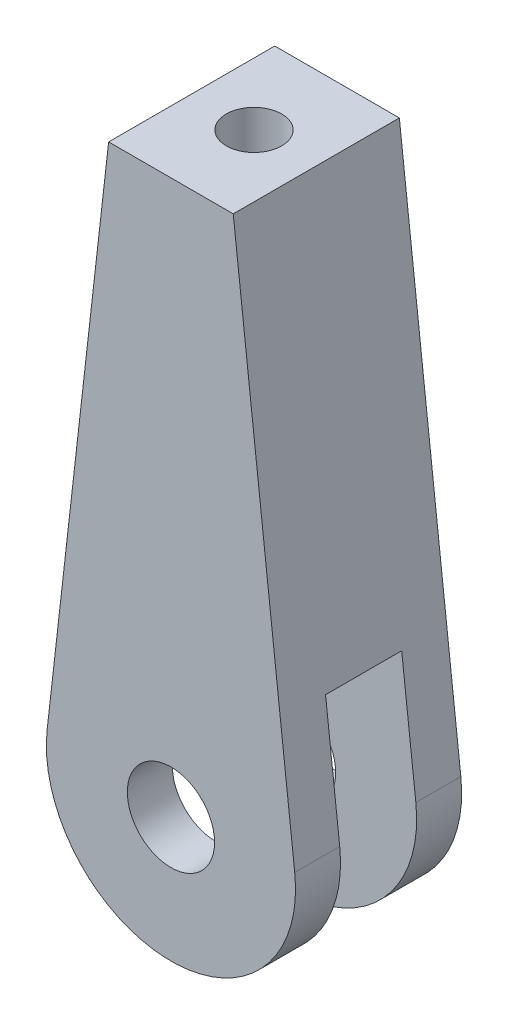
ISO-10303-21;
HEADER;
FILE_DESCRIPTION(('STEP AP214'),'2;1');
FILE_NAME('part.step','',(''),(''),'','','');
FILE_SCHEMA(('AUTOMOTIVE_DESIGN { 1 0 10303 214 1 1 1 1 }'));
ENDSEC;
DATA;
#1=APPLICATION_CONTEXT('core data for automotive mechanical design processes');
#2=APPLICATION_PROTOCOL_DEFINITION('international standard','automotive_design',2000,#1);
#3=PRODUCT_CONTEXT('',#1,'mechanical');
#4=PRODUCT('Part','Part','',(#3));
#5=PRODUCT_RELATED_PRODUCT_CATEGORY('part','',(#4));
#6=PRODUCT_DEFINITION_FORMATION('','',#4);
#7=PRODUCT_DEFINITION_CONTEXT('part definition',#1,'design');
#8=PRODUCT_DEFINITION('design','',#6,#7);
#9=PRODUCT_DEFINITION_SHAPE('','',#8);
#10=(LENGTH_UNIT() NAMED_UNIT(*) SI_UNIT(.MILLI.,.METRE.));
#11=(NAMED_UNIT(*) PLANE_ANGLE_UNIT() SI_UNIT($,.RADIAN.));
#12=(NAMED_UNIT(*) SI_UNIT($,.STERADIAN.) SOLID_ANGLE_UNIT());
#13=UNCERTAINTY_MEASURE_WITH_UNIT(LENGTH_MEASURE(1.E-05),#10,'distance_accuracy_value','');
#14=(GEOMETRIC_REPRESENTATION_CONTEXT(3) GLOBAL_UNCERTAINTY_ASSIGNED_CONTEXT((#13)) GLOBAL_UNIT_ASSIGNED_CONTEXT((#10,
#11,#12)) REPRESENTATION_CONTEXT('',''));
#15=CARTESIAN_POINT('',(0.,0.,0.));
#16=DIRECTION('',(0.,0.,1.));
#17=DIRECTION('',(1.,0.,0.));
#18=AXIS2_PLACEMENT_3D('',#15,#16,#17);
#19=CARTESIAN_POINT('',(-4.49999999999999,40.,12.));
#20=DIRECTION('',(0.993569552652104,-0.113223425326638,0.));
#21=DIRECTION('',(0.113223425326638,0.993569552652105,0.));
#22=AXIS2_PLACEMENT_3D('',#19,#20,#21);
#23=PLANE('',#22);
#24=DIRECTION('',(-0.113223425326638,-0.993569552652105,0.));
#25=VECTOR('',#24,1.);
#26=CARTESIAN_POINT('',(-4.49999999999999,40.,3.25));
#27=LINE('',#26,#25);
#28=CARTESIAN_POINT('',(-7.91868644296963,10.,3.25));
#29=VERTEX_POINT('',#28);
#30=CARTESIAN_POINT('',(-8.94212597386896,1.01901082793975,3.25));
#31=VERTEX_POINT('',#30);
#32=EDGE_CURVE('E116',#29,#31,#27,.T.);
#33=ORIENTED_EDGE('',*,*,#32,.F.);
#34=DIRECTION('',(0.,0.,1.));
#35=VECTOR('',#34,1.);
#36=CARTESIAN_POINT('',(-7.91868644296963,10.,12.));
#37=LINE('',#36,#35);
#38=CARTESIAN_POINT('',(-7.91868644296963,10.,8.75));
#39=VERTEX_POINT('',#38);
#40=EDGE_CURVE('E105',#29,#39,#37,.T.);
#41=ORIENTED_EDGE('',*,*,#40,.T.);
#42=DIRECTION('',(0.113223425326638,0.993569552652105,0.));
#43=VECTOR('',#42,1.);
#44=CARTESIAN_POINT('',(-4.49999999999999,40.,8.75));
#45=LINE('',#44,#43);
#46=CARTESIAN_POINT('',(-8.94212597386896,1.01901082793975,8.75));
#47=VERTEX_POINT('',#46);
#48=EDGE_CURVE('E131',#47,#39,#45,.T.);
#49=ORIENTED_EDGE('',*,*,#48,.F.);
#50=DIRECTION('',(0.,0.,-1.));
#51=VECTOR('',#50,1.);
#52=CARTESIAN_POINT('',(-8.94212597386896,1.01901082793975,12.));
#53=LINE('',#52,#51);
#54=CARTESIAN_POINT('',(-8.94212597386896,1.01901082793975,12.));
#55=VERTEX_POINT('',#54);
#56=EDGE_CURVE('E159',#55,#47,#53,.T.);
#57=ORIENTED_EDGE('',*,*,#56,.F.);
#58=DIRECTION('',(-0.113223425326638,-0.993569552652105,0.));
#59=VECTOR('',#58,1.);
#60=CARTESIAN_POINT('',(-4.49999999999999,40.,12.));
#61=LINE('',#60,#59);
#62=CARTESIAN_POINT('',(-4.49999999999999,40.,12.));
#63=VERTEX_POINT('',#62);
#64=EDGE_CURVE('E138',#63,#55,#61,.T.);
#65=ORIENTED_EDGE('',*,*,#64,.F.);
#66=DIRECTION('',(0.,0.,-1.));
#67=VECTOR('',#66,1.);
#68=CARTESIAN_POINT('',(-4.49999999999999,40.,12.));
#69=LINE('',#68,#67);
#70=CARTESIAN_POINT('',(-4.49999999999999,40.,0.));
#71=VERTEX_POINT('',#70);
#72=EDGE_CURVE('E144',#63,#71,#69,.T.);
#73=ORIENTED_EDGE('',*,*,#72,.T.);
#74=DIRECTION('',(-0.113223425326638,-0.993569552652105,0.));
#75=VECTOR('',#74,1.);
#76=CARTESIAN_POINT('',(-4.49999999999999,40.,0.));
#77=LINE('',#76,#75);
#78=CARTESIAN_POINT('',(-8.94212597386896,1.01901082793975,0.));
#79=VERTEX_POINT('',#78);
#80=EDGE_CURVE('E136',#71,#79,#77,.T.);
#81=ORIENTED_EDGE('',*,*,#80,.T.);
#82=EDGE_CURVE('E124',#31,#79,#53,.T.);
#83=ORIENTED_EDGE('',*,*,#82,.F.);
#84=EDGE_LOOP('',(#33,#41,#49,#57,#65,#73,#81,#83));
#85=FACE_BOUND('',#84,.T.);
#86=ADVANCED_FACE('F32',(#85),#23,.F.);
#87=CARTESIAN_POINT('',(0.,0.,12.));
#88=DIRECTION('',(0.,0.,-1.));
#89=DIRECTION('',(-1.,0.,0.));
#90=AXIS2_PLACEMENT_3D('',#87,#88,#89);
#91=CYLINDRICAL_SURFACE('',#90,9.00000000000002);
#92=CARTESIAN_POINT('',(0.,0.,3.25));
#93=DIRECTION('',(0.,0.,1.));
#94=DIRECTION('',(1.,0.,0.));
#95=AXIS2_PLACEMENT_3D('',#92,#93,#94);
#96=CIRCLE('',#95,9.00000000000002);
#97=CARTESIAN_POINT('',(8.94212597386897,1.01901082793975,3.25));
#98=VERTEX_POINT('',#97);
#99=EDGE_CURVE('E126',#31,#98,#96,.T.);
#100=ORIENTED_EDGE('',*,*,#99,.F.);
#101=ORIENTED_EDGE('',*,*,#82,.T.);
#102=CARTESIAN_POINT('',(0.,0.,0.));
#103=DIRECTION('',(0.,0.,1.));
#104=DIRECTION('',(1.,0.,0.));
#105=AXIS2_PLACEMENT_3D('',#102,#103,#104);
#106=CIRCLE('',#105,9.00000000000002);
#107=CARTESIAN_POINT('',(8.94212597386898,1.01901082793975,0.));
#108=VERTEX_POINT('',#107);
#109=EDGE_CURVE('E146',#79,#108,#106,.T.);
#110=ORIENTED_EDGE('',*,*,#109,.T.);
#111=DIRECTION('',(0.,0.,-1.));
#112=VECTOR('',#111,1.);
#113=CARTESIAN_POINT('',(8.94212597386898,1.01901082793975,12.));
#114=LINE('',#113,#112);
#115=EDGE_CURVE('E155',#98,#108,#114,.T.);
#116=ORIENTED_EDGE('',*,*,#115,.F.);
#117=EDGE_LOOP('',(#100,#101,#110,#116));
#118=FACE_BOUND('',#117,.T.);
#119=ADVANCED_FACE('F203',(#118),#91,.T.);
#120=CARTESIAN_POINT('',(0.,0.,8.75));
#121=DIRECTION('',(0.,0.,-1.));
#122=DIRECTION('',(-1.,0.,0.));
#123=AXIS2_PLACEMENT_3D('',#120,#121,#122);
#124=CIRCLE('',#123,9.00000000000002);
#125=CARTESIAN_POINT('',(8.94212597386897,1.01901082793975,8.75));
#126=VERTEX_POINT('',#125);
#127=EDGE_CURVE('E112',#126,#47,#124,.T.);
#128=ORIENTED_EDGE('',*,*,#127,.F.);
#129=CARTESIAN_POINT('',(8.94212597386898,1.01901082793975,12.));
#130=VERTEX_POINT('',#129);
#131=EDGE_CURVE('E156',#130,#126,#114,.T.);
#132=ORIENTED_EDGE('',*,*,#131,.F.);
#133=CARTESIAN_POINT('',(0.,0.,12.));
#134=DIRECTION('',(0.,0.,1.));
#135=DIRECTION('',(1.,0.,0.));
#136=AXIS2_PLACEMENT_3D('',#133,#134,#135);
#137=CIRCLE('',#136,9.00000000000002);
#138=EDGE_CURVE('E84',#55,#130,#137,.T.);
#139=ORIENTED_EDGE('',*,*,#138,.F.);
#140=ORIENTED_EDGE('',*,*,#56,.T.);
#141=EDGE_LOOP('',(#128,#132,#139,#140));
#142=FACE_BOUND('',#141,.T.);
#143=ADVANCED_FACE('F168',(#142),#91,.T.);
#144=CARTESIAN_POINT('',(4.50000000000001,40.,12.));
#145=DIRECTION('',(-0.993569552652105,-0.113223425326639,0.));
#146=DIRECTION('',(0.113223425326639,-0.993569552652105,0.));
#147=AXIS2_PLACEMENT_3D('',#144,#145,#146);
#148=PLANE('',#147);
#149=DIRECTION('',(-0.113223425326639,0.993569552652105,0.));
#150=VECTOR('',#149,1.);
#151=CARTESIAN_POINT('',(4.50000000000001,40.,3.25));
#152=LINE('',#151,#150);
#153=CARTESIAN_POINT('',(7.91868644296965,10.,3.25));
#154=VERTEX_POINT('',#153);
#155=EDGE_CURVE('E11',#98,#154,#152,.T.);
#156=ORIENTED_EDGE('',*,*,#155,.F.);
#157=ORIENTED_EDGE('',*,*,#115,.T.);
#158=DIRECTION('',(-0.113223425326639,0.993569552652104,0.));
#159=VECTOR('',#158,1.);
#160=CARTESIAN_POINT('',(4.50000000000001,40.,0.));
#161=LINE('',#160,#159);
#162=CARTESIAN_POINT('',(4.50000000000001,40.,0.));
#163=VERTEX_POINT('',#162);
#164=EDGE_CURVE('E149',#108,#163,#161,.T.);
#165=ORIENTED_EDGE('',*,*,#164,.T.);
#166=DIRECTION('',(0.,0.,-1.));
#167=VECTOR('',#166,1.);
#168=CARTESIAN_POINT('',(4.50000000000001,40.,12.));
#169=LINE('',#168,#167);
#170=CARTESIAN_POINT('',(4.50000000000001,40.,12.));
#171=VERTEX_POINT('',#170);
#172=EDGE_CURVE('E153',#171,#163,#169,.T.);
#173=ORIENTED_EDGE('',*,*,#172,.F.);
#174=DIRECTION('',(-0.113223425326639,0.993569552652104,0.));
#175=VECTOR('',#174,1.);
#176=CARTESIAN_POINT('',(4.50000000000001,40.,12.));
#177=LINE('',#176,#175);
#178=EDGE_CURVE('E141',#130,#171,#177,.T.);
#179=ORIENTED_EDGE('',*,*,#178,.F.);
#180=ORIENTED_EDGE('',*,*,#131,.T.);
#181=DIRECTION('',(0.113223425326639,-0.993569552652105,0.));
#182=VECTOR('',#181,1.);
#183=CARTESIAN_POINT('',(4.50000000000001,40.,8.75));
#184=LINE('',#183,#182);
#185=CARTESIAN_POINT('',(7.91868644296965,10.,8.75));
#186=VERTEX_POINT('',#185);
#187=EDGE_CURVE('E40',#186,#126,#184,.T.);
#188=ORIENTED_EDGE('',*,*,#187,.F.);
#189=DIRECTION('',(0.,0.,-1.));
#190=VECTOR('',#189,1.);
#191=CARTESIAN_POINT('',(7.91868644296965,10.,12.));
#192=LINE('',#191,#190);
#193=EDGE_CURVE('E161',#186,#154,#192,.T.);
#194=ORIENTED_EDGE('',*,*,#193,.T.);
#195=EDGE_LOOP('',(#156,#157,#165,#173,#179,#180,#188,#194));
#196=FACE_BOUND('',#195,.T.);
#197=ADVANCED_FACE('F172',(#196),#148,.F.);
#198=CARTESIAN_POINT('',(4.50000000000001,40.,12.));
#199=DIRECTION('',(0.,-1.,0.));
#200=DIRECTION('',(0.,0.,-1.));
#201=AXIS2_PLACEMENT_3D('',#198,#199,#200);
#202=PLANE('',#201);
#203=CARTESIAN_POINT('',(0.,40.,6.));
#204=DIRECTION('',(0.,1.,0.));
#205=DIRECTION('',(0.,0.,1.));
#206=AXIS2_PLACEMENT_3D('',#203,#204,#205);
#207=CIRCLE('',#206,2.);
#208=CARTESIAN_POINT('',(0.,40.,8.));
#209=VERTEX_POINT('',#208);
#210=EDGE_CURVE('E125',#209,#209,#207,.T.);
#211=ORIENTED_EDGE('',*,*,#210,.F.);
#212=EDGE_LOOP('',(#211));
#213=FACE_BOUND('',#212,.T.);
#214=DIRECTION('',(-1.,0.,0.));
#215=VECTOR('',#214,1.);
#216=CARTESIAN_POINT('',(4.50000000000001,40.,0.));
#217=LINE('',#216,#215);
#218=EDGE_CURVE('E76',#163,#71,#217,.T.);
#219=ORIENTED_EDGE('',*,*,#218,.T.);
#220=ORIENTED_EDGE('',*,*,#72,.F.);
#221=DIRECTION('',(-1.,0.,0.));
#222=VECTOR('',#221,1.);
#223=CARTESIAN_POINT('',(4.50000000000001,40.,12.));
#224=LINE('',#223,#222);
#225=EDGE_CURVE('E55',#171,#63,#224,.T.);
#226=ORIENTED_EDGE('',*,*,#225,.F.);
#227=ORIENTED_EDGE('',*,*,#172,.T.);
#228=EDGE_LOOP('',(#219,#220,#226,#227));
#229=FACE_BOUND('',#228,.T.);
#230=ADVANCED_FACE('F214',(#213,#229),#202,.F.);
#231=CARTESIAN_POINT('',(0.,0.,12.));
#232=DIRECTION('',(0.,0.,1.));
#233=DIRECTION('',(1.,0.,0.));
#234=AXIS2_PLACEMENT_3D('',#231,#232,#233);
#235=PLANE('',#234);
#236=CARTESIAN_POINT('',(0.,0.,12.));
#237=DIRECTION('',(0.,0.,1.));
#238=DIRECTION('',(1.,0.,0.));
#239=AXIS2_PLACEMENT_3D('',#236,#237,#238);
#240=CIRCLE('',#239,3.15);
#241=CARTESIAN_POINT('',(3.15,0.,12.));
#242=VERTEX_POINT('',#241);
#243=EDGE_CURVE('E183',#242,#242,#240,.T.);
#244=ORIENTED_EDGE('',*,*,#243,.F.);
#245=EDGE_LOOP('',(#244));
#246=FACE_BOUND('',#245,.T.);
#247=ORIENTED_EDGE('',*,*,#64,.T.);
#248=ORIENTED_EDGE('',*,*,#138,.T.);
#249=ORIENTED_EDGE('',*,*,#178,.T.);
#250=ORIENTED_EDGE('',*,*,#225,.T.);
#251=EDGE_LOOP('',(#247,#248,#249,#250));
#252=FACE_BOUND('',#251,.T.);
#253=ADVANCED_FACE('F174',(#246,#252),#235,.T.);
#254=CARTESIAN_POINT('',(0.,0.,0.));
#255=DIRECTION('',(0.,0.,1.));
#256=DIRECTION('',(1.,0.,0.));
#257=AXIS2_PLACEMENT_3D('',#254,#255,#256);
#258=PLANE('',#257);
#259=CARTESIAN_POINT('',(0.,0.,0.));
#260=DIRECTION('',(0.,0.,1.));
#261=DIRECTION('',(1.,0.,0.));
#262=AXIS2_PLACEMENT_3D('',#259,#260,#261);
#263=CIRCLE('',#262,3.15);
#264=CARTESIAN_POINT('',(3.15,0.,0.));
#265=VERTEX_POINT('',#264);
#266=EDGE_CURVE('E120',#265,#265,#263,.T.);
#267=ORIENTED_EDGE('',*,*,#266,.T.);
#268=EDGE_LOOP('',(#267));
#269=FACE_BOUND('',#268,.T.);
#270=ORIENTED_EDGE('',*,*,#80,.F.);
#271=ORIENTED_EDGE('',*,*,#218,.F.);
#272=ORIENTED_EDGE('',*,*,#164,.F.);
#273=ORIENTED_EDGE('',*,*,#109,.F.);
#274=EDGE_LOOP('',(#270,#271,#272,#273));
#275=FACE_BOUND('',#274,.T.);
#276=ADVANCED_FACE('F218',(#269,#275),#258,.F.);
#277=CARTESIAN_POINT('',(0.,27.5,6.));
#278=DIRECTION('',(0.,1.,0.));
#279=DIRECTION('',(0.,0.,1.));
#280=AXIS2_PLACEMENT_3D('',#277,#278,#279);
#281=CYLINDRICAL_SURFACE('',#280,2.);
#282=CARTESIAN_POINT('',(0.,27.5,6.));
#283=DIRECTION('',(0.,1.,0.));
#284=DIRECTION('',(0.,0.,1.));
#285=AXIS2_PLACEMENT_3D('',#282,#283,#284);
#286=CIRCLE('',#285,2.);
#287=CARTESIAN_POINT('',(0.,27.5,8.));
#288=VERTEX_POINT('',#287);
#289=EDGE_CURVE('E129',#288,#288,#286,.T.);
#290=ORIENTED_EDGE('',*,*,#289,.F.);
#291=EDGE_LOOP('',(#290));
#292=FACE_BOUND('',#291,.T.);
#293=ORIENTED_EDGE('',*,*,#210,.T.);
#294=EDGE_LOOP('',(#293));
#295=FACE_BOUND('',#294,.T.);
#296=ADVANCED_FACE('F221',(#292,#295),#281,.F.);
#297=CARTESIAN_POINT('',(0.,27.5,6.));
#298=DIRECTION('',(0.,1.,0.));
#299=DIRECTION('',(0.,0.,1.));
#300=AXIS2_PLACEMENT_3D('',#297,#298,#299);
#301=PLANE('',#300);
#302=ORIENTED_EDGE('',*,*,#289,.T.);
#303=EDGE_LOOP('',(#302));
#304=FACE_BOUND('',#303,.T.);
#305=ADVANCED_FACE('F199',(#304),#301,.T.);
#306=CARTESIAN_POINT('',(-9.96913347291891,10.,3.25));
#307=DIRECTION('',(0.,0.,1.));
#308=DIRECTION('',(1.,0.,0.));
#309=AXIS2_PLACEMENT_3D('',#306,#307,#308);
#310=PLANE('',#309);
#311=CARTESIAN_POINT('',(0.,0.,3.25));
#312=DIRECTION('',(0.,0.,1.));
#313=DIRECTION('',(1.,0.,0.));
#314=AXIS2_PLACEMENT_3D('',#311,#312,#313);
#315=CIRCLE('',#314,3.15);
#316=CARTESIAN_POINT('',(3.15,0.,3.25));
#317=VERTEX_POINT('',#316);
#318=EDGE_CURVE('E180',#317,#317,#315,.T.);
#319=ORIENTED_EDGE('',*,*,#318,.F.);
#320=EDGE_LOOP('',(#319));
#321=FACE_BOUND('',#320,.T.);
#322=ORIENTED_EDGE('',*,*,#32,.T.);
#323=ORIENTED_EDGE('',*,*,#99,.T.);
#324=ORIENTED_EDGE('',*,*,#155,.T.);
#325=DIRECTION('',(-1.,0.,0.));
#326=VECTOR('',#325,1.);
#327=CARTESIAN_POINT('',(-9.96913347291891,10.,3.25));
#328=LINE('',#327,#326);
#329=EDGE_CURVE('E47',#154,#29,#328,.T.);
#330=ORIENTED_EDGE('',*,*,#329,.T.);
#331=EDGE_LOOP('',(#322,#323,#324,#330));
#332=FACE_BOUND('',#331,.T.);
#333=ADVANCED_FACE('F115',(#321,#332),#310,.T.);
#334=CARTESIAN_POINT('',(-9.96913347291891,10.,8.75));
#335=DIRECTION('',(0.,0.,-1.));
#336=DIRECTION('',(-1.,0.,0.));
#337=AXIS2_PLACEMENT_3D('',#334,#335,#336);
#338=PLANE('',#337);
#339=CARTESIAN_POINT('',(0.,0.,8.75));
#340=DIRECTION('',(0.,0.,-1.));
#341=DIRECTION('',(-1.,0.,0.));
#342=AXIS2_PLACEMENT_3D('',#339,#340,#341);
#343=CIRCLE('',#342,3.15);
#344=CARTESIAN_POINT('',(3.15,0.,8.75));
#345=VERTEX_POINT('',#344);
#346=EDGE_CURVE('E35',#345,#345,#343,.T.);
#347=ORIENTED_EDGE('',*,*,#346,.F.);
#348=EDGE_LOOP('',(#347));
#349=FACE_BOUND('',#348,.T.);
#350=ORIENTED_EDGE('',*,*,#48,.T.);
#351=DIRECTION('',(1.,0.,0.));
#352=VECTOR('',#351,1.);
#353=CARTESIAN_POINT('',(-9.96913347291891,10.,8.75));
#354=LINE('',#353,#352);
#355=EDGE_CURVE('E108',#39,#186,#354,.T.);
#356=ORIENTED_EDGE('',*,*,#355,.T.);
#357=ORIENTED_EDGE('',*,*,#187,.T.);
#358=ORIENTED_EDGE('',*,*,#127,.T.);
#359=EDGE_LOOP('',(#350,#356,#357,#358));
#360=FACE_BOUND('',#359,.T.);
#361=ADVANCED_FACE('F166',(#349,#360),#338,.T.);
#362=CARTESIAN_POINT('',(0.,10.,0.));
#363=DIRECTION('',(0.,1.,0.));
#364=DIRECTION('',(0.,0.,1.));
#365=AXIS2_PLACEMENT_3D('',#362,#363,#364);
#366=PLANE('',#365);
#367=ORIENTED_EDGE('',*,*,#329,.F.);
#368=ORIENTED_EDGE('',*,*,#193,.F.);
#369=ORIENTED_EDGE('',*,*,#355,.F.);
#370=ORIENTED_EDGE('',*,*,#40,.F.);
#371=EDGE_LOOP('',(#367,#368,#369,#370));
#372=FACE_BOUND('',#371,.T.);
#373=ADVANCED_FACE('F106',(#372),#366,.F.);
#374=CARTESIAN_POINT('',(0.,0.,-1.2E-05));
#375=DIRECTION('',(0.,0.,1.));
#376=DIRECTION('',(1.,0.,0.));
#377=AXIS2_PLACEMENT_3D('',#374,#375,#376);
#378=CYLINDRICAL_SURFACE('',#377,3.15);
#379=CARTESIAN_POINT('',(3.15,0.,8.75));
#380=CARTESIAN_POINT('',(3.15,0.,8.78385416666667));
#381=CARTESIAN_POINT('',(3.15,0.,8.81770833333334));
#382=CARTESIAN_POINT('',(3.15,0.,8.88541666666667));
#383=CARTESIAN_POINT('',(3.15,0.,8.91927083333334));
#384=CARTESIAN_POINT('',(3.15,0.,8.98697916666667));
#385=CARTESIAN_POINT('',(3.15,0.,9.02083333333334));
#386=CARTESIAN_POINT('',(3.15,0.,9.08854166666667));
#387=CARTESIAN_POINT('',(3.15,0.,9.12239583333334));
#388=CARTESIAN_POINT('',(3.15,0.,9.19010416666667));
#389=CARTESIAN_POINT('',(3.15,0.,9.22395833333334));
#390=CARTESIAN_POINT('',(3.15,0.,9.29166666666667));
#391=CARTESIAN_POINT('',(3.15,0.,9.32552083333334));
#392=CARTESIAN_POINT('',(3.15,0.,9.39322916666667));
#393=CARTESIAN_POINT('',(3.15,0.,9.42708333333334));
#394=CARTESIAN_POINT('',(3.15,0.,9.49479166666667));
#395=CARTESIAN_POINT('',(3.15,0.,9.52864583333334));
#396=CARTESIAN_POINT('',(3.15,0.,9.59635416666667));
#397=CARTESIAN_POINT('',(3.15,0.,9.63020833333333));
#398=CARTESIAN_POINT('',(3.15,0.,9.69791666666667));
#399=CARTESIAN_POINT('',(3.15,0.,9.73177083333334));
#400=CARTESIAN_POINT('',(3.15,0.,9.79947916666667));
#401=CARTESIAN_POINT('',(3.15,0.,9.83333333333333));
#402=CARTESIAN_POINT('',(3.15,0.,9.90104166666667));
#403=CARTESIAN_POINT('',(3.15,0.,9.93489583333333));
#404=CARTESIAN_POINT('',(3.15,0.,10.0026041666667));
#405=CARTESIAN_POINT('',(3.15,0.,10.0364583333333));
#406=CARTESIAN_POINT('',(3.15,0.,10.1041666666667));
#407=CARTESIAN_POINT('',(3.15,0.,10.1380208333333));
#408=CARTESIAN_POINT('',(3.15,0.,10.2057291666667));
#409=CARTESIAN_POINT('',(3.15,0.,10.2395833333333));
#410=CARTESIAN_POINT('',(3.15,0.,10.3072916666667));
#411=CARTESIAN_POINT('',(3.15,0.,10.3411458333333));
#412=CARTESIAN_POINT('',(3.15,0.,10.4088541666667));
#413=CARTESIAN_POINT('',(3.15,0.,10.4427083333333));
#414=CARTESIAN_POINT('',(3.15,0.,10.5104166666667));
#415=CARTESIAN_POINT('',(3.15,0.,10.5442708333333));
#416=CARTESIAN_POINT('',(3.15,0.,10.6119791666667));
#417=CARTESIAN_POINT('',(3.15,0.,10.6458333333333));
#418=CARTESIAN_POINT('',(3.15,0.,10.7135416666667));
#419=CARTESIAN_POINT('',(3.15,0.,10.7473958333333));
#420=CARTESIAN_POINT('',(3.15,0.,10.8151041666667));
#421=CARTESIAN_POINT('',(3.15,0.,10.8489583333333));
#422=CARTESIAN_POINT('',(3.15,0.,10.9166666666667));
#423=CARTESIAN_POINT('',(3.15,0.,10.9505208333333));
#424=CARTESIAN_POINT('',(3.15,0.,11.0182291666667));
#425=CARTESIAN_POINT('',(3.15,0.,11.0520833333333));
#426=CARTESIAN_POINT('',(3.15,0.,11.1197916666667));
#427=CARTESIAN_POINT('',(3.15,0.,11.1536458333333));
#428=CARTESIAN_POINT('',(3.15,0.,11.2213541666667));
#429=CARTESIAN_POINT('',(3.15,0.,11.2552083333333));
#430=CARTESIAN_POINT('',(3.15,0.,11.3229166666667));
#431=CARTESIAN_POINT('',(3.15,0.,11.3567708333333));
#432=CARTESIAN_POINT('',(3.15,0.,11.4244791666667));
#433=CARTESIAN_POINT('',(3.15,0.,11.4583333333333));
#434=CARTESIAN_POINT('',(3.15,0.,11.5260416666667));
#435=CARTESIAN_POINT('',(3.15,0.,11.5598958333333));
#436=CARTESIAN_POINT('',(3.15,0.,11.6276041666667));
#437=CARTESIAN_POINT('',(3.15,0.,11.6614583333333));
#438=CARTESIAN_POINT('',(3.15,0.,11.7291666666667));
#439=CARTESIAN_POINT('',(3.15,0.,11.7630208333333));
#440=CARTESIAN_POINT('',(3.15,0.,11.8307291666667));
#441=CARTESIAN_POINT('',(3.15,0.,11.8645833333333));
#442=CARTESIAN_POINT('',(3.15,0.,11.9322916666667));
#443=CARTESIAN_POINT('',(3.15,0.,11.9661458333333));
#444=CARTESIAN_POINT('',(3.15,0.,12.));
#445=B_SPLINE_CURVE_WITH_KNOTS('',3,(#379,#380,#381,#382,#383,#384,#385,#386,#387,#388,#389,
#390,#391,#392,#393,#394,#395,#396,#397,#398,#399,#400,#401,#402,#403,#404,#405,#406,#407,#408,
#409,#410,#411,#412,#413,#414,#415,#416,#417,#418,#419,#420,#421,#422,#423,#424,#425,#426,#427,
#428,#429,#430,#431,#432,#433,#434,#435,#436,#437,#438,#439,#440,#441,#442,#443,#444),
.UNSPECIFIED.,.F.,.F.,(4,2,2,2,2,2,2,2,2,2,2,2,2,2,2,2,2,2,2,2,2,2,2,2,2,2,2,2,2,2,2,2,4),(0.,
0.101562499999999,0.203125,0.304687499999999,0.40625,0.5078125,0.609374999999999,0.7109375,
0.812499999999999,0.914062499999998,1.015625,1.1171875,1.21875,1.3203125,1.421875,1.5234375,
1.625,1.7265625,1.828125,1.9296875,2.03125,2.1328125,2.234375,2.3359375,2.4375,2.5390625,
2.640625,2.7421875,2.84375,2.9453125,3.046875,3.1484375,3.25),.UNSPECIFIED.);
#446=EDGE_CURVE('BSEAM190',#345,#242,#445,.T.);
#447=ORIENTED_EDGE('',*,*,#346,.T.);
#448=ORIENTED_EDGE('',*,*,#243,.T.);
#449=ORIENTED_EDGE('',*,*,#446,.T.);
#450=ORIENTED_EDGE('',*,*,#446,.F.);
#451=EDGE_LOOP('',(#447,#449,#448,#450));
#452=FACE_BOUND('',#451,.T.);
#453=ADVANCED_FACE('F190',(#452),#378,.F.);
#454=CARTESIAN_POINT('',(3.15,0.,3.25));
#455=CARTESIAN_POINT('',(3.15,0.,3.21614583333333));
#456=CARTESIAN_POINT('',(3.15,0.,3.18229166666667));
#457=CARTESIAN_POINT('',(3.15,0.,3.11458333333333));
#458=CARTESIAN_POINT('',(3.15,0.,3.08072916666667));
#459=CARTESIAN_POINT('',(3.15,0.,3.01302083333333));
#460=CARTESIAN_POINT('',(3.15,0.,2.97916666666667));
#461=CARTESIAN_POINT('',(3.15,0.,2.91145833333333));
#462=CARTESIAN_POINT('',(3.15,0.,2.87760416666667));
#463=CARTESIAN_POINT('',(3.15,0.,2.80989583333333));
#464=CARTESIAN_POINT('',(3.15,0.,2.77604166666667));
#465=CARTESIAN_POINT('',(3.15,0.,2.70833333333333));
#466=CARTESIAN_POINT('',(3.15,0.,2.67447916666667));
#467=CARTESIAN_POINT('',(3.15,0.,2.60677083333333));
#468=CARTESIAN_POINT('',(3.15,0.,2.57291666666667));
#469=CARTESIAN_POINT('',(3.15,0.,2.50520833333333));
#470=CARTESIAN_POINT('',(3.15,0.,2.47135416666667));
#471=CARTESIAN_POINT('',(3.15,0.,2.40364583333333));
#472=CARTESIAN_POINT('',(3.15,0.,2.36979166666667));
#473=CARTESIAN_POINT('',(3.15,0.,2.30208333333333));
#474=CARTESIAN_POINT('',(3.15,0.,2.26822916666667));
#475=CARTESIAN_POINT('',(3.15,0.,2.20052083333333));
#476=CARTESIAN_POINT('',(3.15,0.,2.16666666666667));
#477=CARTESIAN_POINT('',(3.15,0.,2.09895833333333));
#478=CARTESIAN_POINT('',(3.15,0.,2.06510416666667));
#479=CARTESIAN_POINT('',(3.15,0.,1.99739583333333));
#480=CARTESIAN_POINT('',(3.15,0.,1.96354166666667));
#481=CARTESIAN_POINT('',(3.15,0.,1.89583333333333));
#482=CARTESIAN_POINT('',(3.15,0.,1.86197916666667));
#483=CARTESIAN_POINT('',(3.15,0.,1.79427083333333));
#484=CARTESIAN_POINT('',(3.15,0.,1.76041666666667));
#485=CARTESIAN_POINT('',(3.15,0.,1.69270833333333));
#486=CARTESIAN_POINT('',(3.15,0.,1.65885416666667));
#487=CARTESIAN_POINT('',(3.15,0.,1.59114583333333));
#488=CARTESIAN_POINT('',(3.15,0.,1.55729166666667));
#489=CARTESIAN_POINT('',(3.15,0.,1.48958333333333));
#490=CARTESIAN_POINT('',(3.15,0.,1.45572916666667));
#491=CARTESIAN_POINT('',(3.15,0.,1.38802083333333));
#492=CARTESIAN_POINT('',(3.15,0.,1.35416666666667));
#493=CARTESIAN_POINT('',(3.15,0.,1.28645833333333));
#494=CARTESIAN_POINT('',(3.15,0.,1.25260416666667));
#495=CARTESIAN_POINT('',(3.15,0.,1.18489583333333));
#496=CARTESIAN_POINT('',(3.15,0.,1.15104166666667));
#497=CARTESIAN_POINT('',(3.15,0.,1.08333333333333));
#498=CARTESIAN_POINT('',(3.15,0.,1.04947916666667));
#499=CARTESIAN_POINT('',(3.15,0.,0.981770833333334));
#500=CARTESIAN_POINT('',(3.15,0.,0.947916666666667));
#501=CARTESIAN_POINT('',(3.15,0.,0.880208333333334));
#502=CARTESIAN_POINT('',(3.15,0.,0.846354166666667));
#503=CARTESIAN_POINT('',(3.15,0.,0.778645833333334));
#504=CARTESIAN_POINT('',(3.15,0.,0.744791666666667));
#505=CARTESIAN_POINT('',(3.15,0.,0.677083333333334));
#506=CARTESIAN_POINT('',(3.15,0.,0.643229166666667));
#507=CARTESIAN_POINT('',(3.15,0.,0.575520833333333));
#508=CARTESIAN_POINT('',(3.15,0.,0.541666666666667));
#509=CARTESIAN_POINT('',(3.15,0.,0.473958333333333));
#510=CARTESIAN_POINT('',(3.15,0.,0.440104166666667));
#511=CARTESIAN_POINT('',(3.15,0.,0.372395833333333));
#512=CARTESIAN_POINT('',(3.15,0.,0.338541666666667));
#513=CARTESIAN_POINT('',(3.15,0.,0.270833333333334));
#514=CARTESIAN_POINT('',(3.15,0.,0.236979166666667));
#515=CARTESIAN_POINT('',(3.15,0.,0.169270833333334));
#516=CARTESIAN_POINT('',(3.15,0.,0.135416666666667));
#517=CARTESIAN_POINT('',(3.15,0.,0.0677083333333336));
#518=CARTESIAN_POINT('',(3.15,0.,0.0338541666666669));
#519=CARTESIAN_POINT('',(3.15,0.,0.));
#520=B_SPLINE_CURVE_WITH_KNOTS('',3,(#454,#455,#456,#457,#458,#459,#460,#461,#462,#463,#464,
#465,#466,#467,#468,#469,#470,#471,#472,#473,#474,#475,#476,#477,#478,#479,#480,#481,#482,#483,
#484,#485,#486,#487,#488,#489,#490,#491,#492,#493,#494,#495,#496,#497,#498,#499,#500,#501,#502,
#503,#504,#505,#506,#507,#508,#509,#510,#511,#512,#513,#514,#515,#516,#517,#518,#519),
.UNSPECIFIED.,.F.,.F.,(4,2,2,2,2,2,2,2,2,2,2,2,2,2,2,2,2,2,2,2,2,2,2,2,2,2,2,2,2,2,2,2,4),(0.,
0.1015625,0.203125,0.3046875,0.40625,0.5078125,0.609375,0.7109375,0.8125,0.9140625,1.015625,
1.1171875,1.21875,1.3203125,1.421875,1.5234375,1.625,1.7265625,1.828125,1.9296875,2.03125,
2.1328125,2.234375,2.3359375,2.4375,2.5390625,2.640625,2.7421875,2.84375,2.9453125,3.046875,
3.1484375,3.25),.UNSPECIFIED.);
#521=EDGE_CURVE('BSEAM261',#317,#265,#520,.T.);
#522=ORIENTED_EDGE('',*,*,#318,.T.);
#523=ORIENTED_EDGE('',*,*,#266,.F.);
#524=ORIENTED_EDGE('',*,*,#521,.T.);
#525=ORIENTED_EDGE('',*,*,#521,.F.);
#526=EDGE_LOOP('',(#522,#524,#523,#525));
#527=FACE_BOUND('',#526,.T.);
#528=ADVANCED_FACE('F261',(#527),#378,.F.);
#529=CLOSED_SHELL('',(#86,#119,#143,#197,#230,#253,#276,#296,#305,#333,#361,#373,#453,#528));
#530=MANIFOLD_SOLID_BREP('B2',#529);
#531=ADVANCED_BREP_SHAPE_REPRESENTATION('',(#18,#530),#14);
#532=SHAPE_DEFINITION_REPRESENTATION(#9,#531);
ENDSEC;
END-ISO-10303-21;
